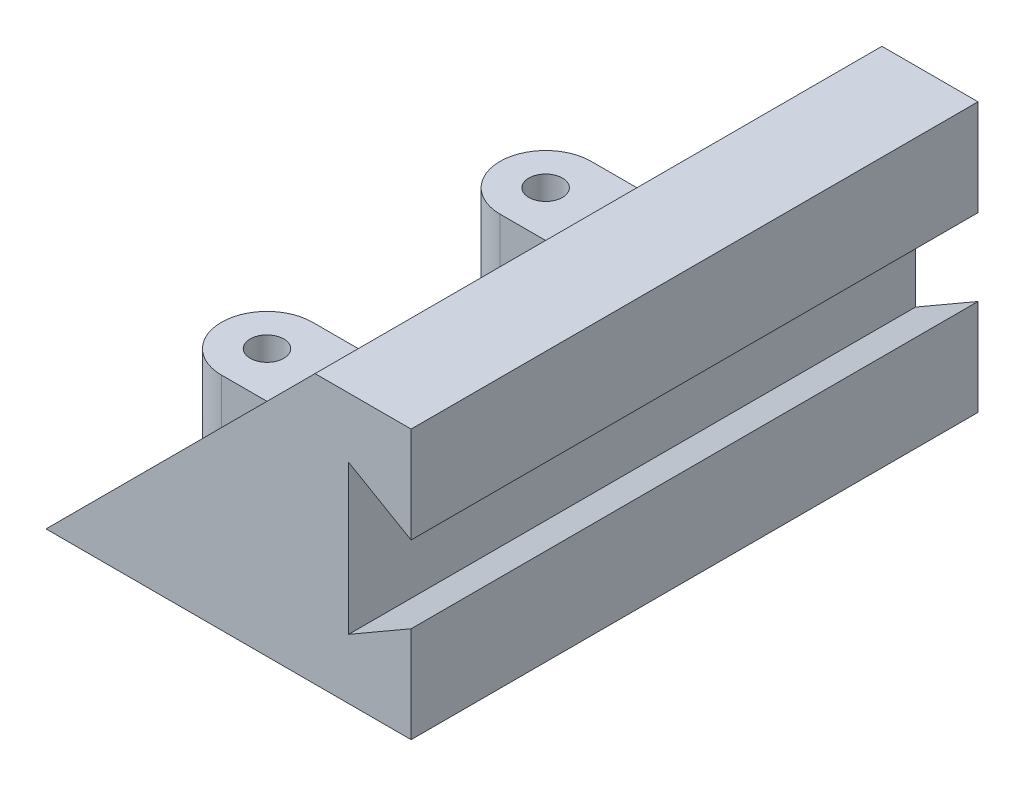
ISO-10303-21;
HEADER;
FILE_DESCRIPTION(('STEP AP214'),'2;1');
FILE_NAME('part.step','',(''),(''),'','','');
FILE_SCHEMA(('AUTOMOTIVE_DESIGN { 1 0 10303 214 1 1 1 1 }'));
ENDSEC;
DATA;
#1=APPLICATION_CONTEXT('core data for automotive mechanical design processes');
#2=APPLICATION_PROTOCOL_DEFINITION('international standard','automotive_design',2000,#1);
#3=PRODUCT_CONTEXT('',#1,'mechanical');
#4=PRODUCT('Part','Part','',(#3));
#5=PRODUCT_RELATED_PRODUCT_CATEGORY('part','',(#4));
#6=PRODUCT_DEFINITION_FORMATION('','',#4);
#7=PRODUCT_DEFINITION_CONTEXT('part definition',#1,'design');
#8=PRODUCT_DEFINITION('design','',#6,#7);
#9=PRODUCT_DEFINITION_SHAPE('','',#8);
#10=(LENGTH_UNIT() NAMED_UNIT(*) SI_UNIT(.MILLI.,.METRE.));
#11=(NAMED_UNIT(*) PLANE_ANGLE_UNIT() SI_UNIT($,.RADIAN.));
#12=(NAMED_UNIT(*) SI_UNIT($,.STERADIAN.) SOLID_ANGLE_UNIT());
#13=UNCERTAINTY_MEASURE_WITH_UNIT(LENGTH_MEASURE(1.E-05),#10,'distance_accuracy_value','');
#14=(GEOMETRIC_REPRESENTATION_CONTEXT(3) GLOBAL_UNCERTAINTY_ASSIGNED_CONTEXT((#13)) GLOBAL_UNIT_ASSIGNED_CONTEXT((#10,
#11,#12)) REPRESENTATION_CONTEXT('',''));
#15=CARTESIAN_POINT('',(0.,0.,0.));
#16=DIRECTION('',(0.,0.,1.));
#17=DIRECTION('',(1.,0.,0.));
#18=AXIS2_PLACEMENT_3D('',#15,#16,#17);
#19=CARTESIAN_POINT('',(-10.,18.,59.));
#20=DIRECTION('',(0.707106781186544,-0.707106781186551,0.));
#21=DIRECTION('',(0.707106781186551,0.707106781186544,0.));
#22=AXIS2_PLACEMENT_3D('',#19,#20,#21);
#23=PLANE('',#22);
#24=DIRECTION('',(-0.707106781186551,-0.707106781186544,0.));
#25=VECTOR('',#24,1.);
#26=CARTESIAN_POINT('',(-10.,18.,0.));
#27=LINE('',#26,#25);
#28=CARTESIAN_POINT('',(-10.,18.,0.));
#29=VERTEX_POINT('',#28);
#30=CARTESIAN_POINT('',(-38.0000000000003,-10.,0.));
#31=VERTEX_POINT('',#30);
#32=EDGE_CURVE('E251',#29,#31,#27,.T.);
#33=ORIENTED_EDGE('',*,*,#32,.T.);
#34=DIRECTION('',(0.,0.,-1.));
#35=VECTOR('',#34,1.);
#36=CARTESIAN_POINT('',(-38.0000000000003,-10.,59.));
#37=LINE('',#36,#35);
#38=CARTESIAN_POINT('',(-38.0000000000003,-10.,59.));
#39=VERTEX_POINT('',#38);
#40=EDGE_CURVE('E48',#39,#31,#37,.T.);
#41=ORIENTED_EDGE('',*,*,#40,.F.);
#42=DIRECTION('',(-0.707106781186551,-0.707106781186544,0.));
#43=VECTOR('',#42,1.);
#44=CARTESIAN_POINT('',(-10.,18.,59.));
#45=LINE('',#44,#43);
#46=CARTESIAN_POINT('',(-10.,18.,59.));
#47=VERTEX_POINT('',#46);
#48=EDGE_CURVE('E222',#47,#39,#45,.T.);
#49=ORIENTED_EDGE('',*,*,#48,.F.);
#50=DIRECTION('',(0.,0.,-1.));
#51=VECTOR('',#50,1.);
#52=CARTESIAN_POINT('',(-10.,18.,59.));
#53=LINE('',#52,#51);
#54=EDGE_CURVE('E11',#47,#29,#53,.T.);
#55=ORIENTED_EDGE('',*,*,#54,.T.);
#56=EDGE_LOOP('',(#33,#41,#49,#55));
#57=FACE_BOUND('',#56,.T.);
#58=DIRECTION('',(0.,0.,-1.));
#59=VECTOR('',#58,1.);
#60=CARTESIAN_POINT('',(-25.25,2.75000000000016,48.75));
#61=LINE('',#60,#59);
#62=CARTESIAN_POINT('',(-25.25,2.75000000000015,48.75));
#63=VERTEX_POINT('',#62);
#64=CARTESIAN_POINT('',(-25.25,2.75000000000016,39.25));
#65=VERTEX_POINT('',#64);
#66=EDGE_CURVE('E195',#63,#65,#61,.T.);
#67=ORIENTED_EDGE('',*,*,#66,.F.);
#68=DIRECTION('',(-0.707106781186551,-0.707106781186544,0.));
#69=VECTOR('',#68,1.);
#70=CARTESIAN_POINT('',(-9.99999999999999,18.,48.75));
#71=LINE('',#70,#69);
#72=CARTESIAN_POINT('',(-30.,-1.99999999999979,48.75));
#73=VERTEX_POINT('',#72);
#74=EDGE_CURVE('E214',#63,#73,#71,.T.);
#75=ORIENTED_EDGE('',*,*,#74,.T.);
#76=CARTESIAN_POINT('',(-30.,-1.99999999999979,44.));
#77=DIRECTION('',(0.707106781186544,-0.707106781186551,0.));
#78=DIRECTION('',(-0.707106781186551,-0.707106781186544,0.));
#79=AXIS2_PLACEMENT_3D('',#76,#77,#78);
#80=ELLIPSE('',#79,6.71751442127216,4.75);
#81=CARTESIAN_POINT('',(-30.,-1.99999999999979,39.25));
#82=VERTEX_POINT('',#81);
#83=EDGE_CURVE('E204',#73,#82,#80,.T.);
#84=ORIENTED_EDGE('',*,*,#83,.T.);
#85=DIRECTION('',(-0.707106781186551,-0.707106781186544,0.));
#86=VECTOR('',#85,1.);
#87=CARTESIAN_POINT('',(-10.,18.,39.25));
#88=LINE('',#87,#86);
#89=EDGE_CURVE('E210',#65,#82,#88,.T.);
#90=ORIENTED_EDGE('',*,*,#89,.F.);
#91=EDGE_LOOP('',(#67,#75,#84,#90));
#92=FACE_BOUND('',#91,.T.);
#93=DIRECTION('',(-0.707106781186551,-0.707106781186544,0.));
#94=VECTOR('',#93,1.);
#95=CARTESIAN_POINT('',(-10.,18.,10.25));
#96=LINE('',#95,#94);
#97=CARTESIAN_POINT('',(-25.25,2.75000000000016,10.25));
#98=VERTEX_POINT('',#97);
#99=CARTESIAN_POINT('',(-30.,-1.99999999999979,10.25));
#100=VERTEX_POINT('',#99);
#101=EDGE_CURVE('E136',#98,#100,#96,.T.);
#102=ORIENTED_EDGE('',*,*,#101,.F.);
#103=DIRECTION('',(0.,0.,1.));
#104=VECTOR('',#103,1.);
#105=CARTESIAN_POINT('',(-25.25,2.75000000000016,10.25));
#106=LINE('',#105,#104);
#107=CARTESIAN_POINT('',(-25.25,2.75000000000015,19.75));
#108=VERTEX_POINT('',#107);
#109=EDGE_CURVE('E139',#98,#108,#106,.T.);
#110=ORIENTED_EDGE('',*,*,#109,.T.);
#111=DIRECTION('',(-0.707106781186551,-0.707106781186544,0.));
#112=VECTOR('',#111,1.);
#113=CARTESIAN_POINT('',(-9.99999999999997,18.,19.75));
#114=LINE('',#113,#112);
#115=CARTESIAN_POINT('',(-30.,-1.99999999999979,19.75));
#116=VERTEX_POINT('',#115);
#117=EDGE_CURVE('E60',#108,#116,#114,.T.);
#118=ORIENTED_EDGE('',*,*,#117,.T.);
#119=CARTESIAN_POINT('',(-30.,-1.99999999999979,15.));
#120=DIRECTION('',(0.707106781186544,-0.707106781186551,0.));
#121=DIRECTION('',(-0.707106781186551,-0.707106781186544,0.));
#122=AXIS2_PLACEMENT_3D('',#119,#120,#121);
#123=ELLIPSE('',#122,6.71751442127216,4.75);
#124=EDGE_CURVE('E55',#100,#116,#123,.F.);
#125=ORIENTED_EDGE('',*,*,#124,.F.);
#126=EDGE_LOOP('',(#102,#110,#118,#125));
#127=FACE_BOUND('',#126,.T.);
#128=ADVANCED_FACE('F39',(#57,#92,#127),#23,.F.);
#129=CARTESIAN_POINT('',(0.,18.,59.));
#130=DIRECTION('',(0.,-1.,0.));
#131=DIRECTION('',(1.,0.,0.));
#132=AXIS2_PLACEMENT_3D('',#129,#130,#131);
#133=PLANE('',#132);
#134=DIRECTION('',(-1.,0.,0.));
#135=VECTOR('',#134,1.);
#136=CARTESIAN_POINT('',(0.,18.,0.));
#137=LINE('',#136,#135);
#138=CARTESIAN_POINT('',(0.,18.,0.));
#139=VERTEX_POINT('',#138);
#140=EDGE_CURVE('E217',#139,#29,#137,.T.);
#141=ORIENTED_EDGE('',*,*,#140,.T.);
#142=ORIENTED_EDGE('',*,*,#54,.F.);
#143=DIRECTION('',(-1.,0.,0.));
#144=VECTOR('',#143,1.);
#145=CARTESIAN_POINT('',(0.,18.,59.));
#146=LINE('',#145,#144);
#147=CARTESIAN_POINT('',(0.,18.,59.));
#148=VERTEX_POINT('',#147);
#149=EDGE_CURVE('E218',#148,#47,#146,.T.);
#150=ORIENTED_EDGE('',*,*,#149,.F.);
#151=DIRECTION('',(0.,0.,-1.));
#152=VECTOR('',#151,1.);
#153=CARTESIAN_POINT('',(0.,18.,59.));
#154=LINE('',#153,#152);
#155=EDGE_CURVE('E247',#148,#139,#154,.T.);
#156=ORIENTED_EDGE('',*,*,#155,.T.);
#157=EDGE_LOOP('',(#141,#142,#150,#156));
#158=FACE_BOUND('',#157,.T.);
#159=ADVANCED_FACE('F41',(#158),#133,.F.);
#160=CARTESIAN_POINT('',(-38.0000000000003,-10.,59.));
#161=DIRECTION('',(0.,1.,0.));
#162=DIRECTION('',(-1.,0.,0.));
#163=AXIS2_PLACEMENT_3D('',#160,#161,#162);
#164=PLANE('',#163);
#165=CARTESIAN_POINT('',(-30.,-10.,15.));
#166=DIRECTION('',(0.,1.,0.));
#167=DIRECTION('',(1.,0.,0.));
#168=AXIS2_PLACEMENT_3D('',#165,#166,#167);
#169=CIRCLE('',#168,1.75);
#170=CARTESIAN_POINT('',(-28.25,-10.,15.));
#171=VERTEX_POINT('',#170);
#172=EDGE_CURVE('E354',#171,#171,#169,.T.);
#173=ORIENTED_EDGE('',*,*,#172,.T.);
#174=EDGE_LOOP('',(#173));
#175=FACE_BOUND('',#174,.T.);
#176=DIRECTION('',(1.,0.,0.));
#177=VECTOR('',#176,1.);
#178=CARTESIAN_POINT('',(-38.0000000000003,-10.,0.));
#179=LINE('',#178,#177);
#180=CARTESIAN_POINT('',(0.,-10.,0.));
#181=VERTEX_POINT('',#180);
#182=EDGE_CURVE('E254',#31,#181,#179,.T.);
#183=ORIENTED_EDGE('',*,*,#182,.T.);
#184=DIRECTION('',(0.,0.,-1.));
#185=VECTOR('',#184,1.);
#186=CARTESIAN_POINT('',(0.,-10.,59.));
#187=LINE('',#186,#185);
#188=CARTESIAN_POINT('',(0.,-10.,59.));
#189=VERTEX_POINT('',#188);
#190=EDGE_CURVE('E290',#189,#181,#187,.T.);
#191=ORIENTED_EDGE('',*,*,#190,.F.);
#192=DIRECTION('',(1.,0.,0.));
#193=VECTOR('',#192,1.);
#194=CARTESIAN_POINT('',(-38.0000000000003,-10.,59.));
#195=LINE('',#194,#193);
#196=EDGE_CURVE('E226',#39,#189,#195,.T.);
#197=ORIENTED_EDGE('',*,*,#196,.F.);
#198=ORIENTED_EDGE('',*,*,#40,.T.);
#199=EDGE_LOOP('',(#183,#191,#197,#198));
#200=FACE_BOUND('',#199,.T.);
#201=CARTESIAN_POINT('',(-30.,-10.,44.));
#202=DIRECTION('',(0.,-1.,0.));
#203=DIRECTION('',(1.,0.,0.));
#204=AXIS2_PLACEMENT_3D('',#201,#202,#203);
#205=CIRCLE('',#204,1.75);
#206=CARTESIAN_POINT('',(-28.25,-10.,44.));
#207=VERTEX_POINT('',#206);
#208=EDGE_CURVE('E144',#207,#207,#205,.T.);
#209=ORIENTED_EDGE('',*,*,#208,.F.);
#210=EDGE_LOOP('',(#209));
#211=FACE_BOUND('',#210,.T.);
#212=ADVANCED_FACE('F299',(#175,#200,#211),#164,.F.);
#213=CARTESIAN_POINT('',(0.,-10.,59.));
#214=DIRECTION('',(-1.,0.,0.));
#215=DIRECTION('',(0.,0.,1.));
#216=AXIS2_PLACEMENT_3D('',#213,#214,#215);
#217=PLANE('',#216);
#218=DIRECTION('',(0.,1.,0.));
#219=VECTOR('',#218,1.);
#220=CARTESIAN_POINT('',(0.,-10.,0.));
#221=LINE('',#220,#219);
#222=CARTESIAN_POINT('',(0.,0.,0.));
#223=VERTEX_POINT('',#222);
#224=EDGE_CURVE('E257',#181,#223,#221,.T.);
#225=ORIENTED_EDGE('',*,*,#224,.T.);
#226=DIRECTION('',(0.,0.,-1.));
#227=VECTOR('',#226,1.);
#228=CARTESIAN_POINT('',(0.,0.,59.));
#229=LINE('',#228,#227);
#230=CARTESIAN_POINT('',(0.,0.,59.));
#231=VERTEX_POINT('',#230);
#232=EDGE_CURVE('E287',#231,#223,#229,.T.);
#233=ORIENTED_EDGE('',*,*,#232,.F.);
#234=DIRECTION('',(0.,1.,0.));
#235=VECTOR('',#234,1.);
#236=CARTESIAN_POINT('',(0.,-10.,59.));
#237=LINE('',#236,#235);
#238=EDGE_CURVE('E229',#189,#231,#237,.T.);
#239=ORIENTED_EDGE('',*,*,#238,.F.);
#240=ORIENTED_EDGE('',*,*,#190,.T.);
#241=EDGE_LOOP('',(#225,#233,#239,#240));
#242=FACE_BOUND('',#241,.T.);
#243=ADVANCED_FACE('F310',(#242),#217,.F.);
#244=CARTESIAN_POINT('',(-6.5,-3.75277674973255,59.));
#245=DIRECTION('',(-0.499999999999998,0.86602540378444,0.));
#246=DIRECTION('',(-0.86602540378444,-0.499999999999998,0.));
#247=AXIS2_PLACEMENT_3D('',#244,#245,#246);
#248=PLANE('',#247);
#249=DIRECTION('',(0.86602540378444,0.499999999999998,0.));
#250=VECTOR('',#249,1.);
#251=CARTESIAN_POINT('',(-6.5,-3.75277674973255,0.));
#252=LINE('',#251,#250);
#253=CARTESIAN_POINT('',(-6.5,-3.75277674973255,0.));
#254=VERTEX_POINT('',#253);
#255=EDGE_CURVE('E261',#254,#223,#252,.T.);
#256=ORIENTED_EDGE('',*,*,#255,.F.);
#257=DIRECTION('',(0.,0.,-1.));
#258=VECTOR('',#257,1.);
#259=CARTESIAN_POINT('',(-6.5,-3.75277674973255,59.));
#260=LINE('',#259,#258);
#261=CARTESIAN_POINT('',(-6.5,-3.75277674973255,59.));
#262=VERTEX_POINT('',#261);
#263=EDGE_CURVE('E284',#262,#254,#260,.T.);
#264=ORIENTED_EDGE('',*,*,#263,.F.);
#265=DIRECTION('',(0.86602540378444,0.499999999999998,0.));
#266=VECTOR('',#265,1.);
#267=CARTESIAN_POINT('',(-6.5,-3.75277674973255,59.));
#268=LINE('',#267,#266);
#269=EDGE_CURVE('E232',#262,#231,#268,.T.);
#270=ORIENTED_EDGE('',*,*,#269,.T.);
#271=ORIENTED_EDGE('',*,*,#232,.T.);
#272=EDGE_LOOP('',(#256,#264,#270,#271));
#273=FACE_BOUND('',#272,.T.);
#274=ADVANCED_FACE('F332',(#273),#248,.T.);
#275=CARTESIAN_POINT('',(-6.5,11.7527767497325,59.));
#276=DIRECTION('',(1.,0.,0.));
#277=DIRECTION('',(0.,1.,0.));
#278=AXIS2_PLACEMENT_3D('',#275,#276,#277);
#279=PLANE('',#278);
#280=DIRECTION('',(0.,-1.,0.));
#281=VECTOR('',#280,1.);
#282=CARTESIAN_POINT('',(-6.5,11.7527767497325,0.));
#283=LINE('',#282,#281);
#284=CARTESIAN_POINT('',(-6.5,11.7527767497325,0.));
#285=VERTEX_POINT('',#284);
#286=EDGE_CURVE('E265',#285,#254,#283,.T.);
#287=ORIENTED_EDGE('',*,*,#286,.F.);
#288=DIRECTION('',(0.,0.,-1.));
#289=VECTOR('',#288,1.);
#290=CARTESIAN_POINT('',(-6.5,11.7527767497325,59.));
#291=LINE('',#290,#289);
#292=CARTESIAN_POINT('',(-6.5,11.7527767497325,59.));
#293=VERTEX_POINT('',#292);
#294=EDGE_CURVE('E281',#293,#285,#291,.T.);
#295=ORIENTED_EDGE('',*,*,#294,.F.);
#296=DIRECTION('',(0.,-1.,0.));
#297=VECTOR('',#296,1.);
#298=CARTESIAN_POINT('',(-6.5,11.7527767497325,59.));
#299=LINE('',#298,#297);
#300=EDGE_CURVE('E236',#293,#262,#299,.T.);
#301=ORIENTED_EDGE('',*,*,#300,.T.);
#302=ORIENTED_EDGE('',*,*,#263,.T.);
#303=EDGE_LOOP('',(#287,#295,#301,#302));
#304=FACE_BOUND('',#303,.T.);
#305=ADVANCED_FACE('F330',(#304),#279,.T.);
#306=CARTESIAN_POINT('',(0.,8.,59.));
#307=DIRECTION('',(-0.499999999999998,-0.86602540378444,0.));
#308=DIRECTION('',(0.86602540378444,-0.499999999999998,0.));
#309=AXIS2_PLACEMENT_3D('',#306,#307,#308);
#310=PLANE('',#309);
#311=DIRECTION('',(-0.86602540378444,0.499999999999998,0.));
#312=VECTOR('',#311,1.);
#313=CARTESIAN_POINT('',(0.,8.,0.));
#314=LINE('',#313,#312);
#315=CARTESIAN_POINT('',(0.,8.,0.));
#316=VERTEX_POINT('',#315);
#317=EDGE_CURVE('E269',#316,#285,#314,.T.);
#318=ORIENTED_EDGE('',*,*,#317,.F.);
#319=DIRECTION('',(0.,0.,-1.));
#320=VECTOR('',#319,1.);
#321=CARTESIAN_POINT('',(0.,8.,59.));
#322=LINE('',#321,#320);
#323=CARTESIAN_POINT('',(0.,8.,59.));
#324=VERTEX_POINT('',#323);
#325=EDGE_CURVE('E278',#324,#316,#322,.T.);
#326=ORIENTED_EDGE('',*,*,#325,.F.);
#327=DIRECTION('',(-0.86602540378444,0.499999999999998,0.));
#328=VECTOR('',#327,1.);
#329=CARTESIAN_POINT('',(0.,8.,59.));
#330=LINE('',#329,#328);
#331=EDGE_CURVE('E240',#324,#293,#330,.T.);
#332=ORIENTED_EDGE('',*,*,#331,.T.);
#333=ORIENTED_EDGE('',*,*,#294,.T.);
#334=EDGE_LOOP('',(#318,#326,#332,#333));
#335=FACE_BOUND('',#334,.T.);
#336=ADVANCED_FACE('F325',(#335),#310,.T.);
#337=CARTESIAN_POINT('',(0.,8.,59.));
#338=DIRECTION('',(-1.,0.,0.));
#339=DIRECTION('',(0.,0.,1.));
#340=AXIS2_PLACEMENT_3D('',#337,#338,#339);
#341=PLANE('',#340);
#342=DIRECTION('',(0.,1.,0.));
#343=VECTOR('',#342,1.);
#344=CARTESIAN_POINT('',(0.,8.,0.));
#345=LINE('',#344,#343);
#346=EDGE_CURVE('E223',#316,#139,#345,.T.);
#347=ORIENTED_EDGE('',*,*,#346,.T.);
#348=ORIENTED_EDGE('',*,*,#155,.F.);
#349=DIRECTION('',(0.,1.,0.));
#350=VECTOR('',#349,1.);
#351=CARTESIAN_POINT('',(0.,8.,59.));
#352=LINE('',#351,#350);
#353=EDGE_CURVE('E244',#324,#148,#352,.T.);
#354=ORIENTED_EDGE('',*,*,#353,.F.);
#355=ORIENTED_EDGE('',*,*,#325,.T.);
#356=EDGE_LOOP('',(#347,#348,#354,#355));
#357=FACE_BOUND('',#356,.T.);
#358=ADVANCED_FACE('F403',(#357),#341,.F.);
#359=CARTESIAN_POINT('',(0.,0.,59.));
#360=DIRECTION('',(0.,0.,-1.));
#361=DIRECTION('',(-1.,0.,0.));
#362=AXIS2_PLACEMENT_3D('',#359,#360,#361);
#363=PLANE('',#362);
#364=ORIENTED_EDGE('',*,*,#149,.T.);
#365=ORIENTED_EDGE('',*,*,#48,.T.);
#366=ORIENTED_EDGE('',*,*,#196,.T.);
#367=ORIENTED_EDGE('',*,*,#238,.T.);
#368=ORIENTED_EDGE('',*,*,#269,.F.);
#369=ORIENTED_EDGE('',*,*,#300,.F.);
#370=ORIENTED_EDGE('',*,*,#331,.F.);
#371=ORIENTED_EDGE('',*,*,#353,.T.);
#372=EDGE_LOOP('',(#364,#365,#366,#367,#368,#369,#370,#371));
#373=FACE_BOUND('',#372,.T.);
#374=ADVANCED_FACE('F314',(#373),#363,.F.);
#375=CARTESIAN_POINT('',(0.,0.,0.));
#376=DIRECTION('',(0.,0.,-1.));
#377=DIRECTION('',(-1.,0.,0.));
#378=AXIS2_PLACEMENT_3D('',#375,#376,#377);
#379=PLANE('',#378);
#380=ORIENTED_EDGE('',*,*,#140,.F.);
#381=ORIENTED_EDGE('',*,*,#346,.F.);
#382=ORIENTED_EDGE('',*,*,#317,.T.);
#383=ORIENTED_EDGE('',*,*,#286,.T.);
#384=ORIENTED_EDGE('',*,*,#255,.T.);
#385=ORIENTED_EDGE('',*,*,#224,.F.);
#386=ORIENTED_EDGE('',*,*,#182,.F.);
#387=ORIENTED_EDGE('',*,*,#32,.F.);
#388=EDGE_LOOP('',(#380,#381,#382,#383,#384,#385,#386,#387));
#389=FACE_BOUND('',#388,.T.);
#390=ADVANCED_FACE('F306',(#389),#379,.T.);
#391=CARTESIAN_POINT('',(-25.25,2.75000000000016,48.75));
#392=DIRECTION('',(0.,0.,1.));
#393=DIRECTION('',(1.,0.,0.));
#394=AXIS2_PLACEMENT_3D('',#391,#392,#393);
#395=PLANE('',#394);
#396=ORIENTED_EDGE('',*,*,#74,.F.);
#397=DIRECTION('',(-1.,0.,0.));
#398=VECTOR('',#397,1.);
#399=CARTESIAN_POINT('',(-25.25,2.75000000000016,48.75));
#400=LINE('',#399,#398);
#401=CARTESIAN_POINT('',(-30.,2.75000000000016,48.75));
#402=VERTEX_POINT('',#401);
#403=EDGE_CURVE('E184',#63,#402,#400,.T.);
#404=ORIENTED_EDGE('',*,*,#403,.T.);
#405=DIRECTION('',(0.,-1.,0.));
#406=VECTOR('',#405,1.);
#407=CARTESIAN_POINT('',(-30.,2.75000000000016,48.75));
#408=LINE('',#407,#406);
#409=EDGE_CURVE('E199',#402,#73,#408,.T.);
#410=ORIENTED_EDGE('',*,*,#409,.T.);
#411=EDGE_LOOP('',(#396,#404,#410));
#412=FACE_BOUND('',#411,.T.);
#413=ADVANCED_FACE('F393',(#412),#395,.T.);
#414=CARTESIAN_POINT('',(-25.25,2.75000000000016,39.25));
#415=DIRECTION('',(0.,0.,1.));
#416=DIRECTION('',(1.,0.,0.));
#417=AXIS2_PLACEMENT_3D('',#414,#415,#416);
#418=PLANE('',#417);
#419=DIRECTION('',(-1.,0.,0.));
#420=VECTOR('',#419,1.);
#421=CARTESIAN_POINT('',(-25.25,2.75000000000016,39.25));
#422=LINE('',#421,#420);
#423=CARTESIAN_POINT('',(-30.,2.75000000000016,39.25));
#424=VERTEX_POINT('',#423);
#425=EDGE_CURVE('E192',#65,#424,#422,.T.);
#426=ORIENTED_EDGE('',*,*,#425,.F.);
#427=ORIENTED_EDGE('',*,*,#89,.T.);
#428=DIRECTION('',(0.,-1.,0.));
#429=VECTOR('',#428,1.);
#430=CARTESIAN_POINT('',(-30.,2.75000000000016,39.25));
#431=LINE('',#430,#429);
#432=EDGE_CURVE('E200',#424,#82,#431,.T.);
#433=ORIENTED_EDGE('',*,*,#432,.F.);
#434=EDGE_LOOP('',(#426,#427,#433));
#435=FACE_BOUND('',#434,.T.);
#436=ADVANCED_FACE('F390',(#435),#418,.F.);
#437=CARTESIAN_POINT('',(-30.,2.75000000000016,44.));
#438=DIRECTION('',(0.,-1.,0.));
#439=DIRECTION('',(1.,0.,0.));
#440=AXIS2_PLACEMENT_3D('',#437,#438,#439);
#441=CYLINDRICAL_SURFACE('',#440,4.75);
#442=ORIENTED_EDGE('',*,*,#83,.F.);
#443=ORIENTED_EDGE('',*,*,#409,.F.);
#444=CARTESIAN_POINT('',(-30.,2.75000000000016,44.));
#445=DIRECTION('',(0.,-1.,0.));
#446=DIRECTION('',(1.,0.,0.));
#447=AXIS2_PLACEMENT_3D('',#444,#445,#446);
#448=CIRCLE('',#447,4.75);
#449=EDGE_CURVE('E188',#402,#424,#448,.T.);
#450=ORIENTED_EDGE('',*,*,#449,.T.);
#451=ORIENTED_EDGE('',*,*,#432,.T.);
#452=EDGE_LOOP('',(#442,#443,#450,#451));
#453=FACE_BOUND('',#452,.T.);
#454=ADVANCED_FACE('F388',(#453),#441,.T.);
#455=CARTESIAN_POINT('',(-30.,2.75000000000016,44.));
#456=DIRECTION('',(0.,-1.,0.));
#457=DIRECTION('',(1.,0.,0.));
#458=AXIS2_PLACEMENT_3D('',#455,#456,#457);
#459=PLANE('',#458);
#460=CARTESIAN_POINT('',(-30.,2.75000000000016,44.));
#461=DIRECTION('',(0.,-1.,0.));
#462=DIRECTION('',(1.,0.,0.));
#463=AXIS2_PLACEMENT_3D('',#460,#461,#462);
#464=CIRCLE('',#463,1.75);
#465=CARTESIAN_POINT('',(-28.25,2.75000000000016,44.));
#466=VERTEX_POINT('',#465);
#467=EDGE_CURVE('E180',#466,#466,#464,.F.);
#468=ORIENTED_EDGE('',*,*,#467,.F.);
#469=EDGE_LOOP('',(#468));
#470=FACE_BOUND('',#469,.T.);
#471=ORIENTED_EDGE('',*,*,#403,.F.);
#472=ORIENTED_EDGE('',*,*,#66,.T.);
#473=ORIENTED_EDGE('',*,*,#425,.T.);
#474=ORIENTED_EDGE('',*,*,#449,.F.);
#475=EDGE_LOOP('',(#471,#472,#473,#474));
#476=FACE_BOUND('',#475,.T.);
#477=ADVANCED_FACE('F384',(#470,#476),#459,.F.);
#478=CARTESIAN_POINT('',(-30.,7.69974746830599,44.));
#479=DIRECTION('',(0.,-1.,0.));
#480=DIRECTION('',(1.,0.,0.));
#481=AXIS2_PLACEMENT_3D('',#478,#479,#480);
#482=CYLINDRICAL_SURFACE('',#481,1.75);
#483=ORIENTED_EDGE('',*,*,#467,.T.);
#484=EDGE_LOOP('',(#483));
#485=FACE_BOUND('',#484,.T.);
#486=ORIENTED_EDGE('',*,*,#208,.T.);
#487=EDGE_LOOP('',(#486));
#488=FACE_BOUND('',#487,.T.);
#489=ADVANCED_FACE('F381',(#485,#488),#482,.F.);
#490=CARTESIAN_POINT('',(-25.25,2.75000000000016,10.25));
#491=DIRECTION('',(0.,0.,1.));
#492=DIRECTION('',(1.,0.,0.));
#493=AXIS2_PLACEMENT_3D('',#490,#491,#492);
#494=PLANE('',#493);
#495=DIRECTION('',(-1.,0.,0.));
#496=VECTOR('',#495,1.);
#497=CARTESIAN_POINT('',(-25.25,2.75000000000016,10.25));
#498=LINE('',#497,#496);
#499=CARTESIAN_POINT('',(-30.,2.75000000000016,10.25));
#500=VERTEX_POINT('',#499);
#501=EDGE_CURVE('E147',#98,#500,#498,.T.);
#502=ORIENTED_EDGE('',*,*,#501,.F.);
#503=ORIENTED_EDGE('',*,*,#101,.T.);
#504=DIRECTION('',(0.,-1.,0.));
#505=VECTOR('',#504,1.);
#506=CARTESIAN_POINT('',(-30.,2.75000000000016,10.25));
#507=LINE('',#506,#505);
#508=EDGE_CURVE('E149',#500,#100,#507,.T.);
#509=ORIENTED_EDGE('',*,*,#508,.F.);
#510=EDGE_LOOP('',(#502,#503,#509));
#511=FACE_BOUND('',#510,.T.);
#512=ADVANCED_FACE('F148',(#511),#494,.F.);
#513=CARTESIAN_POINT('',(-30.,2.75000000000016,15.));
#514=DIRECTION('',(0.,-1.,0.));
#515=DIRECTION('',(1.,0.,0.));
#516=AXIS2_PLACEMENT_3D('',#513,#514,#515);
#517=CYLINDRICAL_SURFACE('',#516,4.75);
#518=ORIENTED_EDGE('',*,*,#508,.T.);
#519=ORIENTED_EDGE('',*,*,#124,.T.);
#520=DIRECTION('',(0.,-1.,0.));
#521=VECTOR('',#520,1.);
#522=CARTESIAN_POINT('',(-30.,2.75000000000016,19.75));
#523=LINE('',#522,#521);
#524=CARTESIAN_POINT('',(-30.,2.75000000000016,19.75));
#525=VERTEX_POINT('',#524);
#526=EDGE_CURVE('E167',#525,#116,#523,.T.);
#527=ORIENTED_EDGE('',*,*,#526,.F.);
#528=CARTESIAN_POINT('',(-30.,2.75000000000016,15.));
#529=DIRECTION('',(0.,1.,0.));
#530=DIRECTION('',(1.,0.,0.));
#531=AXIS2_PLACEMENT_3D('',#528,#529,#530);
#532=CIRCLE('',#531,4.75);
#533=EDGE_CURVE('E161',#500,#525,#532,.T.);
#534=ORIENTED_EDGE('',*,*,#533,.F.);
#535=EDGE_LOOP('',(#518,#519,#527,#534));
#536=FACE_BOUND('',#535,.T.);
#537=ADVANCED_FACE('F372',(#536),#517,.T.);
#538=CARTESIAN_POINT('',(-25.25,2.75000000000016,19.75));
#539=DIRECTION('',(0.,0.,1.));
#540=DIRECTION('',(1.,0.,0.));
#541=AXIS2_PLACEMENT_3D('',#538,#539,#540);
#542=PLANE('',#541);
#543=ORIENTED_EDGE('',*,*,#117,.F.);
#544=DIRECTION('',(-1.,0.,0.));
#545=VECTOR('',#544,1.);
#546=CARTESIAN_POINT('',(-25.25,2.75000000000016,19.75));
#547=LINE('',#546,#545);
#548=EDGE_CURVE('E157',#108,#525,#547,.T.);
#549=ORIENTED_EDGE('',*,*,#548,.T.);
#550=ORIENTED_EDGE('',*,*,#526,.T.);
#551=EDGE_LOOP('',(#543,#549,#550));
#552=FACE_BOUND('',#551,.T.);
#553=ADVANCED_FACE('F369',(#552),#542,.T.);
#554=CARTESIAN_POINT('',(-30.,2.75000000000016,15.));
#555=DIRECTION('',(0.,-1.,0.));
#556=DIRECTION('',(1.,0.,0.));
#557=AXIS2_PLACEMENT_3D('',#554,#555,#556);
#558=PLANE('',#557);
#559=CARTESIAN_POINT('',(-30.,2.75000000000016,15.));
#560=DIRECTION('',(0.,-1.,0.));
#561=DIRECTION('',(1.,0.,0.));
#562=AXIS2_PLACEMENT_3D('',#559,#560,#561);
#563=CIRCLE('',#562,1.75);
#564=CARTESIAN_POINT('',(-28.25,2.75000000000016,15.));
#565=VERTEX_POINT('',#564);
#566=EDGE_CURVE('E152',#565,#565,#563,.T.);
#567=ORIENTED_EDGE('',*,*,#566,.T.);
#568=EDGE_LOOP('',(#567));
#569=FACE_BOUND('',#568,.T.);
#570=ORIENTED_EDGE('',*,*,#501,.T.);
#571=ORIENTED_EDGE('',*,*,#533,.T.);
#572=ORIENTED_EDGE('',*,*,#548,.F.);
#573=ORIENTED_EDGE('',*,*,#109,.F.);
#574=EDGE_LOOP('',(#570,#571,#572,#573));
#575=FACE_BOUND('',#574,.T.);
#576=ADVANCED_FACE('F155',(#569,#575),#558,.F.);
#577=CARTESIAN_POINT('',(-30.,7.699747468306,15.));
#578=DIRECTION('',(0.,-1.,0.));
#579=DIRECTION('',(1.,0.,0.));
#580=AXIS2_PLACEMENT_3D('',#577,#578,#579);
#581=CYLINDRICAL_SURFACE('',#580,1.75);
#582=ORIENTED_EDGE('',*,*,#566,.F.);
#583=EDGE_LOOP('',(#582));
#584=FACE_BOUND('',#583,.T.);
#585=ORIENTED_EDGE('',*,*,#172,.F.);
#586=EDGE_LOOP('',(#585));
#587=FACE_BOUND('',#586,.T.);
#588=ADVANCED_FACE('F363',(#584,#587),#581,.F.);
#589=CLOSED_SHELL('',(#128,#159,#212,#243,#274,#305,#336,#358,#374,#390,#413,#436,#454,#477,
#489,#512,#537,#553,#576,#588));
#590=MANIFOLD_SOLID_BREP('B2',#589);
#591=ADVANCED_BREP_SHAPE_REPRESENTATION('',(#18,#590),#14);
#592=SHAPE_DEFINITION_REPRESENTATION(#9,#591);
ENDSEC;
END-ISO-10303-21;
